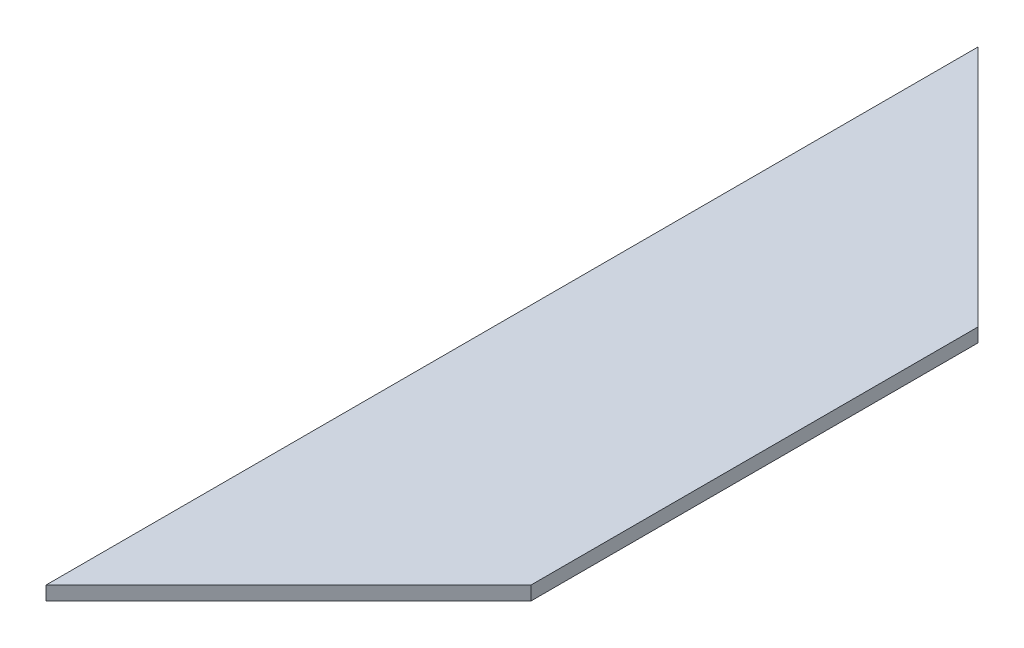
ISO-10303-21;
HEADER;
FILE_DESCRIPTION(('STEP AP214'),'2;1');
FILE_NAME('part.step','',(''),(''),'','','');
FILE_SCHEMA(('AUTOMOTIVE_DESIGN { 1 0 10303 214 1 1 1 1 }'));
ENDSEC;
DATA;
#1=APPLICATION_CONTEXT('core data for automotive mechanical design processes');
#2=APPLICATION_PROTOCOL_DEFINITION('international standard','automotive_design',2000,#1);
#3=PRODUCT_CONTEXT('',#1,'mechanical');
#4=PRODUCT('Part','Part','',(#3));
#5=PRODUCT_RELATED_PRODUCT_CATEGORY('part','',(#4));
#6=PRODUCT_DEFINITION_FORMATION('','',#4);
#7=PRODUCT_DEFINITION_CONTEXT('part definition',#1,'design');
#8=PRODUCT_DEFINITION('design','',#6,#7);
#9=PRODUCT_DEFINITION_SHAPE('','',#8);
#10=(LENGTH_UNIT() NAMED_UNIT(*) SI_UNIT(.MILLI.,.METRE.));
#11=(NAMED_UNIT(*) PLANE_ANGLE_UNIT() SI_UNIT($,.RADIAN.));
#12=(NAMED_UNIT(*) SI_UNIT($,.STERADIAN.) SOLID_ANGLE_UNIT());
#13=UNCERTAINTY_MEASURE_WITH_UNIT(LENGTH_MEASURE(1.E-05),#10,'distance_accuracy_value','');
#14=(GEOMETRIC_REPRESENTATION_CONTEXT(3) GLOBAL_UNCERTAINTY_ASSIGNED_CONTEXT((#13)) GLOBAL_UNIT_ASSIGNED_CONTEXT((#10,
#11,#12)) REPRESENTATION_CONTEXT('',''));
#15=CARTESIAN_POINT('',(0.,0.,0.));
#16=DIRECTION('',(0.,0.,1.));
#17=DIRECTION('',(1.,0.,0.));
#18=AXIS2_PLACEMENT_3D('',#15,#16,#17);
#19=CARTESIAN_POINT('',(18.,10.,47.));
#20=DIRECTION('',(-0.707106781186553,0.,-0.707106781186542));
#21=DIRECTION('',(0.707106781186542,0.,-0.707106781186553));
#22=AXIS2_PLACEMENT_3D('',#19,#20,#21);
#23=PLANE('',#22);
#24=DIRECTION('',(0.,1.,0.));
#25=VECTOR('',#24,1.);
#26=CARTESIAN_POINT('',(18.,10.,47.));
#27=LINE('',#26,#25);
#28=CARTESIAN_POINT('',(18.,10.,47.));
#29=VERTEX_POINT('',#28);
#30=CARTESIAN_POINT('',(18.,10.2,47.));
#31=VERTEX_POINT('',#30);
#32=EDGE_CURVE('E11',#29,#31,#27,.T.);
#33=ORIENTED_EDGE('',*,*,#32,.F.);
#34=DIRECTION('',(0.707106781186542,0.,-0.707106781186553));
#35=VECTOR('',#34,1.);
#36=CARTESIAN_POINT('',(18.,10.,47.));
#37=LINE('',#36,#35);
#38=CARTESIAN_POINT('',(21.5,10.,43.5));
#39=VERTEX_POINT('',#38);
#40=EDGE_CURVE('E88',#29,#39,#37,.T.);
#41=ORIENTED_EDGE('',*,*,#40,.T.);
#42=DIRECTION('',(0.,1.,0.));
#43=VECTOR('',#42,1.);
#44=CARTESIAN_POINT('',(21.5,10.,43.5));
#45=LINE('',#44,#43);
#46=CARTESIAN_POINT('',(21.5,10.2,43.5));
#47=VERTEX_POINT('',#46);
#48=EDGE_CURVE('E43',#39,#47,#45,.T.);
#49=ORIENTED_EDGE('',*,*,#48,.T.);
#50=DIRECTION('',(0.707106781186542,0.,-0.707106781186553));
#51=VECTOR('',#50,1.);
#52=CARTESIAN_POINT('',(18.,10.2,47.));
#53=LINE('',#52,#51);
#54=EDGE_CURVE('E101',#31,#47,#53,.T.);
#55=ORIENTED_EDGE('',*,*,#54,.F.);
#56=EDGE_LOOP('',(#33,#41,#49,#55));
#57=FACE_BOUND('',#56,.T.);
#58=ADVANCED_FACE('F33',(#57),#23,.F.);
#59=CARTESIAN_POINT('',(21.5,10.,0.));
#60=DIRECTION('',(-1.,0.,0.));
#61=DIRECTION('',(0.,0.,-1.));
#62=AXIS2_PLACEMENT_3D('',#59,#60,#61);
#63=PLANE('',#62);
#64=ORIENTED_EDGE('',*,*,#48,.F.);
#65=DIRECTION('',(0.,0.,-1.));
#66=VECTOR('',#65,1.);
#67=CARTESIAN_POINT('',(21.5,10.,0.));
#68=LINE('',#67,#66);
#69=CARTESIAN_POINT('',(21.5,10.,37.0463212845019));
#70=VERTEX_POINT('',#69);
#71=EDGE_CURVE('E95',#39,#70,#68,.T.);
#72=ORIENTED_EDGE('',*,*,#71,.T.);
#73=DIRECTION('',(0.,1.,0.));
#74=VECTOR('',#73,1.);
#75=CARTESIAN_POINT('',(21.5,10.,37.0463212845019));
#76=LINE('',#75,#74);
#77=CARTESIAN_POINT('',(21.5,10.2,37.0463212845019));
#78=VERTEX_POINT('',#77);
#79=EDGE_CURVE('E51',#70,#78,#76,.T.);
#80=ORIENTED_EDGE('',*,*,#79,.T.);
#81=DIRECTION('',(0.,0.,-1.));
#82=VECTOR('',#81,1.);
#83=CARTESIAN_POINT('',(21.5,10.2,0.));
#84=LINE('',#83,#82);
#85=EDGE_CURVE('E82',#47,#78,#84,.T.);
#86=ORIENTED_EDGE('',*,*,#85,.F.);
#87=EDGE_LOOP('',(#64,#72,#80,#86));
#88=FACE_BOUND('',#87,.T.);
#89=ADVANCED_FACE('F105',(#88),#63,.F.);
#90=CARTESIAN_POINT('',(21.5,10.,37.0463212845019));
#91=DIRECTION('',(-0.707106781186551,0.,0.707106781186544));
#92=DIRECTION('',(-0.707106781186544,0.,-0.707106781186551));
#93=AXIS2_PLACEMENT_3D('',#90,#91,#92);
#94=PLANE('',#93);
#95=ORIENTED_EDGE('',*,*,#79,.F.);
#96=DIRECTION('',(-0.707106781186544,0.,-0.707106781186551));
#97=VECTOR('',#96,1.);
#98=CARTESIAN_POINT('',(21.5,10.,37.0463212845019));
#99=LINE('',#98,#97);
#100=CARTESIAN_POINT('',(18.,10.,33.5463212845018));
#101=VERTEX_POINT('',#100);
#102=EDGE_CURVE('E87',#70,#101,#99,.T.);
#103=ORIENTED_EDGE('',*,*,#102,.T.);
#104=DIRECTION('',(0.,1.,0.));
#105=VECTOR('',#104,1.);
#106=CARTESIAN_POINT('',(18.,10.,33.5463212845018));
#107=LINE('',#106,#105);
#108=CARTESIAN_POINT('',(18.,10.2,33.5463212845018));
#109=VERTEX_POINT('',#108);
#110=EDGE_CURVE('E37',#101,#109,#107,.T.);
#111=ORIENTED_EDGE('',*,*,#110,.T.);
#112=DIRECTION('',(-0.707106781186544,0.,-0.707106781186551));
#113=VECTOR('',#112,1.);
#114=CARTESIAN_POINT('',(21.5,10.2,37.0463212845019));
#115=LINE('',#114,#113);
#116=EDGE_CURVE('E97',#78,#109,#115,.T.);
#117=ORIENTED_EDGE('',*,*,#116,.F.);
#118=EDGE_LOOP('',(#95,#103,#111,#117));
#119=FACE_BOUND('',#118,.T.);
#120=ADVANCED_FACE('F90',(#119),#94,.F.);
#121=CARTESIAN_POINT('',(18.,10.,0.));
#122=DIRECTION('',(-1.,0.,0.));
#123=DIRECTION('',(0.,0.,-1.));
#124=AXIS2_PLACEMENT_3D('',#121,#122,#123);
#125=PLANE('',#124);
#126=DIRECTION('',(0.,0.,-1.));
#127=VECTOR('',#126,1.);
#128=CARTESIAN_POINT('',(18.,10.,0.));
#129=LINE('',#128,#127);
#130=EDGE_CURVE('E76',#101,#29,#129,.F.);
#131=ORIENTED_EDGE('',*,*,#130,.T.);
#132=ORIENTED_EDGE('',*,*,#32,.T.);
#133=DIRECTION('',(0.,0.,-1.));
#134=VECTOR('',#133,1.);
#135=CARTESIAN_POINT('',(18.,10.2,0.));
#136=LINE('',#135,#134);
#137=EDGE_CURVE('E78',#109,#31,#136,.F.);
#138=ORIENTED_EDGE('',*,*,#137,.F.);
#139=ORIENTED_EDGE('',*,*,#110,.F.);
#140=EDGE_LOOP('',(#131,#132,#138,#139));
#141=FACE_BOUND('',#140,.T.);
#142=ADVANCED_FACE('F35',(#141),#125,.T.);
#143=CARTESIAN_POINT('',(0.,10.2,0.));
#144=DIRECTION('',(0.,-1.,0.));
#145=DIRECTION('',(0.,0.,-1.));
#146=AXIS2_PLACEMENT_3D('',#143,#144,#145);
#147=PLANE('',#146);
#148=ORIENTED_EDGE('',*,*,#116,.T.);
#149=ORIENTED_EDGE('',*,*,#137,.T.);
#150=ORIENTED_EDGE('',*,*,#54,.T.);
#151=ORIENTED_EDGE('',*,*,#85,.T.);
#152=EDGE_LOOP('',(#148,#149,#150,#151));
#153=FACE_BOUND('',#152,.T.);
#154=ADVANCED_FACE('F104',(#153),#147,.F.);
#155=CARTESIAN_POINT('',(0.,10.,0.));
#156=DIRECTION('',(0.,-1.,0.));
#157=DIRECTION('',(0.,0.,-1.));
#158=AXIS2_PLACEMENT_3D('',#155,#156,#157);
#159=PLANE('',#158);
#160=ORIENTED_EDGE('',*,*,#102,.F.);
#161=ORIENTED_EDGE('',*,*,#71,.F.);
#162=ORIENTED_EDGE('',*,*,#40,.F.);
#163=ORIENTED_EDGE('',*,*,#130,.F.);
#164=EDGE_LOOP('',(#160,#161,#162,#163));
#165=FACE_BOUND('',#164,.T.);
#166=ADVANCED_FACE('F85',(#165),#159,.T.);
#167=CLOSED_SHELL('',(#58,#89,#120,#142,#154,#166));
#168=MANIFOLD_SOLID_BREP('B2',#167);
#169=ADVANCED_BREP_SHAPE_REPRESENTATION('',(#18,#168),#14);
#170=SHAPE_DEFINITION_REPRESENTATION(#9,#169);
ENDSEC;
END-ISO-10303-21;
